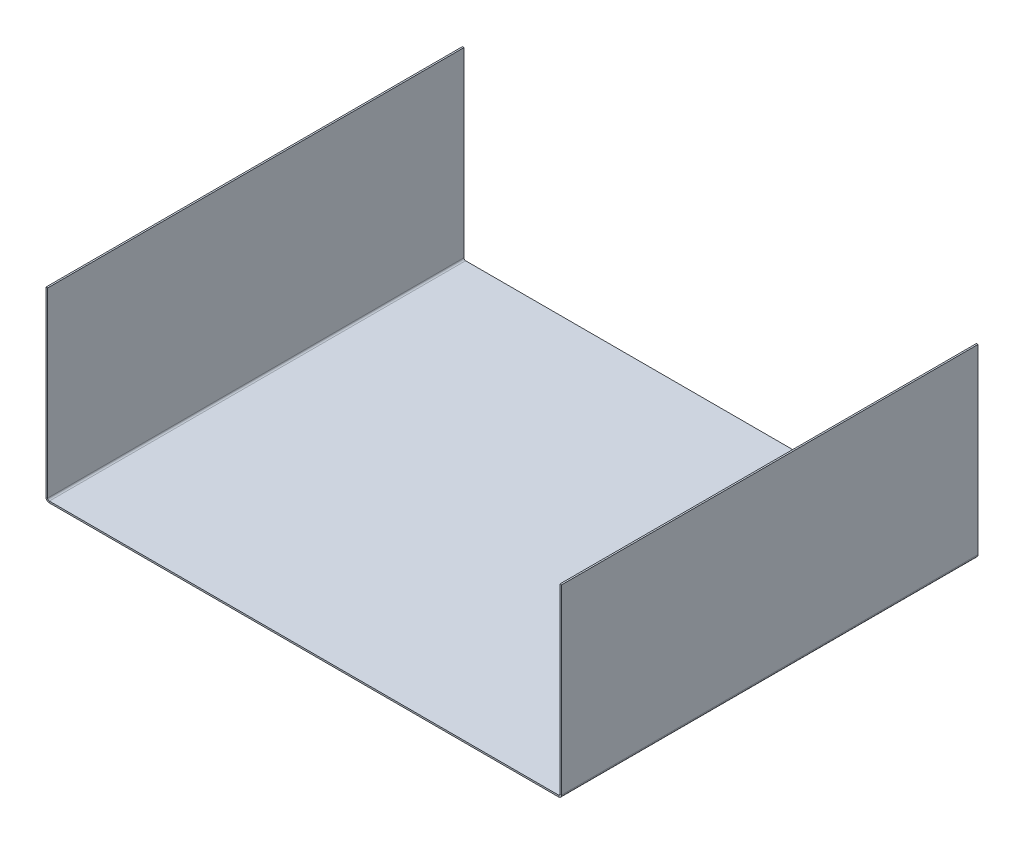
ISO-10303-21;
HEADER;
FILE_DESCRIPTION(('STEP AP214'),'2;1');
FILE_NAME('part.step','',(''),(''),'','','');
FILE_SCHEMA(('AUTOMOTIVE_DESIGN { 1 0 10303 214 1 1 1 1 }'));
ENDSEC;
DATA;
#1=APPLICATION_CONTEXT('core data for automotive mechanical design processes');
#2=APPLICATION_PROTOCOL_DEFINITION('international standard','automotive_design',2000,#1);
#3=PRODUCT_CONTEXT('',#1,'mechanical');
#4=PRODUCT('Part','Part','',(#3));
#5=PRODUCT_RELATED_PRODUCT_CATEGORY('part','',(#4));
#6=PRODUCT_DEFINITION_FORMATION('','',#4);
#7=PRODUCT_DEFINITION_CONTEXT('part definition',#1,'design');
#8=PRODUCT_DEFINITION('design','',#6,#7);
#9=PRODUCT_DEFINITION_SHAPE('','',#8);
#10=(LENGTH_UNIT() NAMED_UNIT(*) SI_UNIT(.MILLI.,.METRE.));
#11=(NAMED_UNIT(*) PLANE_ANGLE_UNIT() SI_UNIT($,.RADIAN.));
#12=(NAMED_UNIT(*) SI_UNIT($,.STERADIAN.) SOLID_ANGLE_UNIT());
#13=UNCERTAINTY_MEASURE_WITH_UNIT(LENGTH_MEASURE(1.E-05),#10,'distance_accuracy_value','');
#14=(GEOMETRIC_REPRESENTATION_CONTEXT(3) GLOBAL_UNCERTAINTY_ASSIGNED_CONTEXT((#13)) GLOBAL_UNIT_ASSIGNED_CONTEXT((#10,
#11,#12)) REPRESENTATION_CONTEXT('',''));
#15=CARTESIAN_POINT('',(0.,0.,0.));
#16=DIRECTION('',(0.,0.,1.));
#17=DIRECTION('',(1.,0.,0.));
#18=AXIS2_PLACEMENT_3D('',#15,#16,#17);
#19=CARTESIAN_POINT('',(0.,-0.7,0.));
#20=DIRECTION('',(0.,-1.,0.));
#21=DIRECTION('',(0.,0.,-1.));
#22=AXIS2_PLACEMENT_3D('',#19,#20,#21);
#23=PLANE('',#22);
#24=DIRECTION('',(-1.,0.,0.));
#25=VECTOR('',#24,1.);
#26=CARTESIAN_POINT('',(111.5,-0.7,-90.));
#27=LINE('',#26,#25);
#28=CARTESIAN_POINT('',(110.0634,-0.700000000000011,-90.));
#29=VERTEX_POINT('',#28);
#30=CARTESIAN_POINT('',(-110.0634,-0.7,-90.));
#31=VERTEX_POINT('',#30);
#32=EDGE_CURVE('E13',#29,#31,#27,.T.);
#33=ORIENTED_EDGE('',*,*,#32,.F.);
#34=DIRECTION('',(0.,0.,-1.));
#35=VECTOR('',#34,1.);
#36=CARTESIAN_POINT('',(110.0634,-0.700000000000011,-90.));
#37=LINE('',#36,#35);
#38=CARTESIAN_POINT('',(110.0634,-0.7,89.9999999999999));
#39=VERTEX_POINT('',#38);
#40=EDGE_CURVE('E208',#29,#39,#37,.F.);
#41=ORIENTED_EDGE('',*,*,#40,.T.);
#42=DIRECTION('',(1.,0.,0.));
#43=VECTOR('',#42,1.);
#44=CARTESIAN_POINT('',(111.5,-0.7,90.));
#45=LINE('',#44,#43);
#46=CARTESIAN_POINT('',(-110.0634,-0.700000000000011,90.));
#47=VERTEX_POINT('',#46);
#48=EDGE_CURVE('E85',#47,#39,#45,.T.);
#49=ORIENTED_EDGE('',*,*,#48,.F.);
#50=DIRECTION('',(0.,0.,1.));
#51=VECTOR('',#50,1.);
#52=CARTESIAN_POINT('',(-110.0634,-0.700000000000011,90.));
#53=LINE('',#52,#51);
#54=EDGE_CURVE('E259',#47,#31,#53,.F.);
#55=ORIENTED_EDGE('',*,*,#54,.T.);
#56=EDGE_LOOP('',(#33,#41,#49,#55));
#57=FACE_BOUND('',#56,.T.);
#58=ADVANCED_FACE('F76',(#57),#23,.T.);
#59=CARTESIAN_POINT('',(0.,0.,0.));
#60=DIRECTION('',(0.,-1.,0.));
#61=DIRECTION('',(0.,0.,-1.));
#62=AXIS2_PLACEMENT_3D('',#59,#60,#61);
#63=PLANE('',#62);
#64=DIRECTION('',(0.,0.,-1.));
#65=VECTOR('',#64,1.);
#66=CARTESIAN_POINT('',(110.0634,0.,-90.));
#67=LINE('',#66,#65);
#68=CARTESIAN_POINT('',(110.0634,0.,-90.));
#69=VERTEX_POINT('',#68);
#70=CARTESIAN_POINT('',(110.0634,0.,89.9999999999999));
#71=VERTEX_POINT('',#70);
#72=EDGE_CURVE('E219',#69,#71,#67,.F.);
#73=ORIENTED_EDGE('',*,*,#72,.F.);
#74=DIRECTION('',(-1.,0.,0.));
#75=VECTOR('',#74,1.);
#76=CARTESIAN_POINT('',(111.5,0.,-90.));
#77=LINE('',#76,#75);
#78=CARTESIAN_POINT('',(-110.0634,0.,-90.));
#79=VERTEX_POINT('',#78);
#80=EDGE_CURVE('E80',#69,#79,#77,.T.);
#81=ORIENTED_EDGE('',*,*,#80,.T.);
#82=DIRECTION('',(0.,0.,1.));
#83=VECTOR('',#82,1.);
#84=CARTESIAN_POINT('',(-110.0634,0.,90.));
#85=LINE('',#84,#83);
#86=CARTESIAN_POINT('',(-110.0634,0.,90.));
#87=VERTEX_POINT('',#86);
#88=EDGE_CURVE('E270',#87,#79,#85,.F.);
#89=ORIENTED_EDGE('',*,*,#88,.F.);
#90=DIRECTION('',(1.,0.,0.));
#91=VECTOR('',#90,1.);
#92=CARTESIAN_POINT('',(111.5,0.,90.));
#93=LINE('',#92,#91);
#94=EDGE_CURVE('E276',#87,#71,#93,.T.);
#95=ORIENTED_EDGE('',*,*,#94,.T.);
#96=EDGE_LOOP('',(#73,#81,#89,#95));
#97=FACE_BOUND('',#96,.T.);
#98=ADVANCED_FACE('F288',(#97),#63,.F.);
#99=CARTESIAN_POINT('',(111.5,-0.7,-90.));
#100=DIRECTION('',(0.,0.,-1.));
#101=DIRECTION('',(-1.,0.,0.));
#102=AXIS2_PLACEMENT_3D('',#99,#100,#101);
#103=PLANE('',#102);
#104=ORIENTED_EDGE('',*,*,#80,.F.);
#105=DIRECTION('',(0.,-1.,0.));
#106=VECTOR('',#105,1.);
#107=CARTESIAN_POINT('',(110.0634,0.,-90.));
#108=LINE('',#107,#106);
#109=EDGE_CURVE('E213',#69,#29,#108,.T.);
#110=ORIENTED_EDGE('',*,*,#109,.T.);
#111=ORIENTED_EDGE('',*,*,#32,.T.);
#112=DIRECTION('',(0.,-1.,0.));
#113=VECTOR('',#112,1.);
#114=CARTESIAN_POINT('',(-110.0634,0.,-90.));
#115=LINE('',#114,#113);
#116=EDGE_CURVE('E274',#79,#31,#115,.T.);
#117=ORIENTED_EDGE('',*,*,#116,.F.);
#118=EDGE_LOOP('',(#104,#110,#111,#117));
#119=FACE_BOUND('',#118,.T.);
#120=ADVANCED_FACE('F290',(#119),#103,.T.);
#121=CARTESIAN_POINT('',(111.5,-0.7,90.));
#122=DIRECTION('',(0.,0.,1.));
#123=DIRECTION('',(1.,0.,0.));
#124=AXIS2_PLACEMENT_3D('',#121,#122,#123);
#125=PLANE('',#124);
#126=DIRECTION('',(0.,-1.,0.));
#127=VECTOR('',#126,1.);
#128=CARTESIAN_POINT('',(110.0634,0.,89.9999999999999));
#129=LINE('',#128,#127);
#130=EDGE_CURVE('E224',#71,#39,#129,.T.);
#131=ORIENTED_EDGE('',*,*,#130,.F.);
#132=ORIENTED_EDGE('',*,*,#94,.F.);
#133=DIRECTION('',(0.,-1.,0.));
#134=VECTOR('',#133,1.);
#135=CARTESIAN_POINT('',(-110.0634,0.,90.));
#136=LINE('',#135,#134);
#137=EDGE_CURVE('E264',#87,#47,#136,.T.);
#138=ORIENTED_EDGE('',*,*,#137,.T.);
#139=ORIENTED_EDGE('',*,*,#48,.T.);
#140=EDGE_LOOP('',(#131,#132,#138,#139));
#141=FACE_BOUND('',#140,.T.);
#142=ADVANCED_FACE('F78',(#141),#125,.T.);
#143=CARTESIAN_POINT('',(-110.0634,0.736600000000006,-90.));
#144=DIRECTION('',(0.,0.,-1.));
#145=DIRECTION('',(-1.,0.,0.));
#146=AXIS2_PLACEMENT_3D('',#143,#144,#145);
#147=PLANE('',#146);
#148=DIRECTION('',(1.,0.,0.));
#149=VECTOR('',#148,1.);
#150=CARTESIAN_POINT('',(-111.5,0.736600000000001,-90.));
#151=LINE('',#150,#149);
#152=CARTESIAN_POINT('',(-110.8,0.736600000000004,-90.));
#153=VERTEX_POINT('',#152);
#154=CARTESIAN_POINT('',(-111.5,0.736600000000001,-90.));
#155=VERTEX_POINT('',#154);
#156=EDGE_CURVE('E226',#153,#155,#151,.F.);
#157=ORIENTED_EDGE('',*,*,#156,.F.);
#158=CARTESIAN_POINT('',(-110.0634,0.736600000000006,-90.));
#159=DIRECTION('',(0.,0.,1.));
#160=DIRECTION('',(1.,0.,0.));
#161=AXIS2_PLACEMENT_3D('',#158,#159,#160);
#162=CIRCLE('',#161,0.736600000000018);
#163=EDGE_CURVE('E267',#79,#153,#162,.F.);
#164=ORIENTED_EDGE('',*,*,#163,.F.);
#165=ORIENTED_EDGE('',*,*,#116,.T.);
#166=CARTESIAN_POINT('',(-110.0634,0.736600000000006,-90.));
#167=DIRECTION('',(0.,0.,1.));
#168=DIRECTION('',(1.,0.,0.));
#169=AXIS2_PLACEMENT_3D('',#166,#167,#168);
#170=CIRCLE('',#169,1.43660000000002);
#171=EDGE_CURVE('E93',#31,#155,#170,.F.);
#172=ORIENTED_EDGE('',*,*,#171,.T.);
#173=EDGE_LOOP('',(#157,#164,#165,#172));
#174=FACE_BOUND('',#173,.T.);
#175=ADVANCED_FACE('F294',(#174),#147,.T.);
#176=CARTESIAN_POINT('',(-110.0634,0.736600000000006,90.));
#177=DIRECTION('',(0.,0.,-1.));
#178=DIRECTION('',(-1.,0.,0.));
#179=AXIS2_PLACEMENT_3D('',#176,#177,#178);
#180=PLANE('',#179);
#181=CARTESIAN_POINT('',(-110.0634,0.736600000000006,90.));
#182=DIRECTION('',(0.,0.,1.));
#183=DIRECTION('',(1.,0.,0.));
#184=AXIS2_PLACEMENT_3D('',#181,#182,#183);
#185=CIRCLE('',#184,0.736600000000018);
#186=CARTESIAN_POINT('',(-110.8,0.736600000000004,90.));
#187=VERTEX_POINT('',#186);
#188=EDGE_CURVE('E232',#187,#87,#185,.T.);
#189=ORIENTED_EDGE('',*,*,#188,.F.);
#190=DIRECTION('',(1.,0.,0.));
#191=VECTOR('',#190,1.);
#192=CARTESIAN_POINT('',(-110.8,0.736600000000004,90.));
#193=LINE('',#192,#191);
#194=CARTESIAN_POINT('',(-111.5,0.736600000000001,90.));
#195=VERTEX_POINT('',#194);
#196=EDGE_CURVE('E252',#187,#195,#193,.F.);
#197=ORIENTED_EDGE('',*,*,#196,.T.);
#198=CARTESIAN_POINT('',(-110.0634,0.736600000000006,90.));
#199=DIRECTION('',(0.,0.,1.));
#200=DIRECTION('',(1.,0.,0.));
#201=AXIS2_PLACEMENT_3D('',#198,#199,#200);
#202=CIRCLE('',#201,1.43660000000002);
#203=EDGE_CURVE('E262',#195,#47,#202,.T.);
#204=ORIENTED_EDGE('',*,*,#203,.T.);
#205=ORIENTED_EDGE('',*,*,#137,.F.);
#206=EDGE_LOOP('',(#189,#197,#204,#205));
#207=FACE_BOUND('',#206,.T.);
#208=ADVANCED_FACE('F318',(#207),#180,.F.);
#209=CARTESIAN_POINT('',(-110.0634,0.736600000000006,90.));
#210=DIRECTION('',(0.,0.,1.));
#211=DIRECTION('',(-1.,0.,0.));
#212=AXIS2_PLACEMENT_3D('',#209,#210,#211);
#213=CYLINDRICAL_SURFACE('',#212,1.43660000000002);
#214=ORIENTED_EDGE('',*,*,#54,.F.);
#215=ORIENTED_EDGE('',*,*,#203,.F.);
#216=DIRECTION('',(0.,0.,1.));
#217=VECTOR('',#216,1.);
#218=CARTESIAN_POINT('',(-111.5,0.736600000000001,-90.));
#219=LINE('',#218,#217);
#220=EDGE_CURVE('E250',#195,#155,#219,.F.);
#221=ORIENTED_EDGE('',*,*,#220,.T.);
#222=ORIENTED_EDGE('',*,*,#171,.F.);
#223=EDGE_LOOP('',(#214,#215,#221,#222));
#224=FACE_BOUND('',#223,.T.);
#225=ADVANCED_FACE('F321',(#224),#213,.T.);
#226=CARTESIAN_POINT('',(-110.0634,0.736600000000006,90.));
#227=DIRECTION('',(0.,0.,1.));
#228=DIRECTION('',(-1.,0.,0.));
#229=AXIS2_PLACEMENT_3D('',#226,#227,#228);
#230=CYLINDRICAL_SURFACE('',#229,0.736600000000018);
#231=ORIENTED_EDGE('',*,*,#88,.T.);
#232=ORIENTED_EDGE('',*,*,#163,.T.);
#233=DIRECTION('',(0.,0.,1.));
#234=VECTOR('',#233,1.);
#235=CARTESIAN_POINT('',(-110.8,0.736600000000004,-90.));
#236=LINE('',#235,#234);
#237=EDGE_CURVE('E255',#153,#187,#236,.T.);
#238=ORIENTED_EDGE('',*,*,#237,.T.);
#239=ORIENTED_EDGE('',*,*,#188,.T.);
#240=EDGE_LOOP('',(#231,#232,#238,#239));
#241=FACE_BOUND('',#240,.T.);
#242=ADVANCED_FACE('F297',(#241),#230,.F.);
#243=CARTESIAN_POINT('',(-111.5,0.,-90.));
#244=DIRECTION('',(0.,0.,1.));
#245=DIRECTION('',(1.,0.,0.));
#246=AXIS2_PLACEMENT_3D('',#243,#244,#245);
#247=PLANE('',#246);
#248=ORIENTED_EDGE('',*,*,#156,.T.);
#249=DIRECTION('',(0.,-1.,0.));
#250=VECTOR('',#249,1.);
#251=CARTESIAN_POINT('',(-111.5,-3.92031038538797E-13,-90.));
#252=LINE('',#251,#250);
#253=CARTESIAN_POINT('',(-111.5,79.4366,-90.));
#254=VERTEX_POINT('',#253);
#255=EDGE_CURVE('E240',#254,#155,#252,.T.);
#256=ORIENTED_EDGE('',*,*,#255,.F.);
#257=DIRECTION('',(1.,0.,0.));
#258=VECTOR('',#257,1.);
#259=CARTESIAN_POINT('',(-111.5,79.4366,-90.));
#260=LINE('',#259,#258);
#261=CARTESIAN_POINT('',(-110.8,79.4366,-90.));
#262=VERTEX_POINT('',#261);
#263=EDGE_CURVE('E233',#254,#262,#260,.T.);
#264=ORIENTED_EDGE('',*,*,#263,.T.);
#265=DIRECTION('',(0.,1.,0.));
#266=VECTOR('',#265,1.);
#267=CARTESIAN_POINT('',(-110.8,0.,-90.));
#268=LINE('',#267,#266);
#269=EDGE_CURVE('E247',#262,#153,#268,.F.);
#270=ORIENTED_EDGE('',*,*,#269,.T.);
#271=EDGE_LOOP('',(#248,#256,#264,#270));
#272=FACE_BOUND('',#271,.T.);
#273=ADVANCED_FACE('F305',(#272),#247,.F.);
#274=CARTESIAN_POINT('',(-111.5,79.4366,90.));
#275=DIRECTION('',(0.,0.,-1.));
#276=DIRECTION('',(-1.,0.,0.));
#277=AXIS2_PLACEMENT_3D('',#274,#275,#276);
#278=PLANE('',#277);
#279=ORIENTED_EDGE('',*,*,#196,.F.);
#280=DIRECTION('',(0.,-1.,0.));
#281=VECTOR('',#280,1.);
#282=CARTESIAN_POINT('',(-110.8,79.4366,90.));
#283=LINE('',#282,#281);
#284=CARTESIAN_POINT('',(-110.8,79.4366,90.));
#285=VERTEX_POINT('',#284);
#286=EDGE_CURVE('E245',#187,#285,#283,.F.);
#287=ORIENTED_EDGE('',*,*,#286,.T.);
#288=DIRECTION('',(1.,0.,0.));
#289=VECTOR('',#288,1.);
#290=CARTESIAN_POINT('',(-111.5,79.4366,90.));
#291=LINE('',#290,#289);
#292=CARTESIAN_POINT('',(-111.5,79.4366,90.));
#293=VERTEX_POINT('',#292);
#294=EDGE_CURVE('E229',#293,#285,#291,.T.);
#295=ORIENTED_EDGE('',*,*,#294,.F.);
#296=DIRECTION('',(0.,1.,0.));
#297=VECTOR('',#296,1.);
#298=CARTESIAN_POINT('',(-111.5,-3.92031038538797E-13,90.));
#299=LINE('',#298,#297);
#300=EDGE_CURVE('E238',#195,#293,#299,.T.);
#301=ORIENTED_EDGE('',*,*,#300,.F.);
#302=EDGE_LOOP('',(#279,#287,#295,#301));
#303=FACE_BOUND('',#302,.T.);
#304=ADVANCED_FACE('F315',(#303),#278,.F.);
#305=CARTESIAN_POINT('',(-111.5,-3.92031038538797E-13,0.));
#306=DIRECTION('',(1.,0.,0.));
#307=DIRECTION('',(0.,1.,0.));
#308=AXIS2_PLACEMENT_3D('',#305,#306,#307);
#309=PLANE('',#308);
#310=ORIENTED_EDGE('',*,*,#220,.F.);
#311=ORIENTED_EDGE('',*,*,#300,.T.);
#312=DIRECTION('',(0.,0.,-1.));
#313=VECTOR('',#312,1.);
#314=CARTESIAN_POINT('',(-111.5,79.4366,0.));
#315=LINE('',#314,#313);
#316=EDGE_CURVE('E236',#293,#254,#315,.T.);
#317=ORIENTED_EDGE('',*,*,#316,.T.);
#318=ORIENTED_EDGE('',*,*,#255,.T.);
#319=EDGE_LOOP('',(#310,#311,#317,#318));
#320=FACE_BOUND('',#319,.T.);
#321=ADVANCED_FACE('F320',(#320),#309,.F.);
#322=CARTESIAN_POINT('',(-110.8,-3.89587001601607E-13,0.));
#323=DIRECTION('',(1.,0.,0.));
#324=DIRECTION('',(0.,1.,0.));
#325=AXIS2_PLACEMENT_3D('',#322,#323,#324);
#326=PLANE('',#325);
#327=ORIENTED_EDGE('',*,*,#286,.F.);
#328=ORIENTED_EDGE('',*,*,#237,.F.);
#329=ORIENTED_EDGE('',*,*,#269,.F.);
#330=DIRECTION('',(0.,0.,1.));
#331=VECTOR('',#330,1.);
#332=CARTESIAN_POINT('',(-110.8,79.4366,-90.));
#333=LINE('',#332,#331);
#334=EDGE_CURVE('E243',#285,#262,#333,.F.);
#335=ORIENTED_EDGE('',*,*,#334,.F.);
#336=EDGE_LOOP('',(#327,#328,#329,#335));
#337=FACE_BOUND('',#336,.T.);
#338=ADVANCED_FACE('F302',(#337),#326,.T.);
#339=CARTESIAN_POINT('',(-111.5,79.4366,-90.));
#340=DIRECTION('',(0.,-1.,0.));
#341=DIRECTION('',(1.,0.,0.));
#342=AXIS2_PLACEMENT_3D('',#339,#340,#341);
#343=PLANE('',#342);
#344=ORIENTED_EDGE('',*,*,#334,.T.);
#345=ORIENTED_EDGE('',*,*,#263,.F.);
#346=ORIENTED_EDGE('',*,*,#316,.F.);
#347=ORIENTED_EDGE('',*,*,#294,.T.);
#348=EDGE_LOOP('',(#344,#345,#346,#347));
#349=FACE_BOUND('',#348,.T.);
#350=ADVANCED_FACE('F310',(#349),#343,.F.);
#351=CARTESIAN_POINT('',(110.0634,0.736600000000006,89.9999999999999));
#352=DIRECTION('',(0.,0.,1.));
#353=DIRECTION('',(1.,0.,0.));
#354=AXIS2_PLACEMENT_3D('',#351,#352,#353);
#355=PLANE('',#354);
#356=DIRECTION('',(-1.,0.,0.));
#357=VECTOR('',#356,1.);
#358=CARTESIAN_POINT('',(111.5,0.736600000000001,89.9999999999999));
#359=LINE('',#358,#357);
#360=CARTESIAN_POINT('',(110.8,0.736600000000004,89.9999999999999));
#361=VERTEX_POINT('',#360);
#362=CARTESIAN_POINT('',(111.5,0.736600000000001,89.9999999999999));
#363=VERTEX_POINT('',#362);
#364=EDGE_CURVE('E191',#361,#363,#359,.F.);
#365=ORIENTED_EDGE('',*,*,#364,.F.);
#366=CARTESIAN_POINT('',(110.0634,0.736600000000006,89.9999999999999));
#367=DIRECTION('',(0.,0.,-1.));
#368=DIRECTION('',(-1.,0.,0.));
#369=AXIS2_PLACEMENT_3D('',#366,#367,#368);
#370=CIRCLE('',#369,0.736600000000018);
#371=EDGE_CURVE('E216',#71,#361,#370,.F.);
#372=ORIENTED_EDGE('',*,*,#371,.F.);
#373=ORIENTED_EDGE('',*,*,#130,.T.);
#374=CARTESIAN_POINT('',(110.0634,0.736600000000006,89.9999999999999));
#375=DIRECTION('',(0.,0.,-1.));
#376=DIRECTION('',(-1.,0.,0.));
#377=AXIS2_PLACEMENT_3D('',#374,#375,#376);
#378=CIRCLE('',#377,1.43660000000002);
#379=EDGE_CURVE('E101',#39,#363,#378,.F.);
#380=ORIENTED_EDGE('',*,*,#379,.T.);
#381=EDGE_LOOP('',(#365,#372,#373,#380));
#382=FACE_BOUND('',#381,.T.);
#383=ADVANCED_FACE('F328',(#382),#355,.T.);
#384=CARTESIAN_POINT('',(110.0634,0.736600000000006,-90.));
#385=DIRECTION('',(0.,0.,1.));
#386=DIRECTION('',(1.,0.,0.));
#387=AXIS2_PLACEMENT_3D('',#384,#385,#386);
#388=PLANE('',#387);
#389=CARTESIAN_POINT('',(110.0634,0.736600000000006,-90.));
#390=DIRECTION('',(0.,0.,-1.));
#391=DIRECTION('',(-1.,0.,0.));
#392=AXIS2_PLACEMENT_3D('',#389,#390,#391);
#393=CIRCLE('',#392,0.736600000000018);
#394=CARTESIAN_POINT('',(110.8,0.736600000000004,-90.));
#395=VERTEX_POINT('',#394);
#396=EDGE_CURVE('E221',#395,#69,#393,.T.);
#397=ORIENTED_EDGE('',*,*,#396,.F.);
#398=DIRECTION('',(-1.,0.,0.));
#399=VECTOR('',#398,1.);
#400=CARTESIAN_POINT('',(110.8,0.736600000000004,-90.));
#401=LINE('',#400,#399);
#402=CARTESIAN_POINT('',(111.5,0.736600000000001,-90.));
#403=VERTEX_POINT('',#402);
#404=EDGE_CURVE('E202',#395,#403,#401,.F.);
#405=ORIENTED_EDGE('',*,*,#404,.T.);
#406=CARTESIAN_POINT('',(110.0634,0.736600000000006,-90.));
#407=DIRECTION('',(0.,0.,-1.));
#408=DIRECTION('',(-1.,0.,0.));
#409=AXIS2_PLACEMENT_3D('',#406,#407,#408);
#410=CIRCLE('',#409,1.43660000000002);
#411=EDGE_CURVE('E211',#403,#29,#410,.T.);
#412=ORIENTED_EDGE('',*,*,#411,.T.);
#413=ORIENTED_EDGE('',*,*,#109,.F.);
#414=EDGE_LOOP('',(#397,#405,#412,#413));
#415=FACE_BOUND('',#414,.T.);
#416=ADVANCED_FACE('F341',(#415),#388,.F.);
#417=CARTESIAN_POINT('',(110.0634,0.736600000000006,-90.));
#418=DIRECTION('',(0.,0.,-1.));
#419=DIRECTION('',(1.,0.,0.));
#420=AXIS2_PLACEMENT_3D('',#417,#418,#419);
#421=CYLINDRICAL_SURFACE('',#420,1.43660000000002);
#422=ORIENTED_EDGE('',*,*,#40,.F.);
#423=ORIENTED_EDGE('',*,*,#411,.F.);
#424=DIRECTION('',(0.,0.,-1.));
#425=VECTOR('',#424,1.);
#426=CARTESIAN_POINT('',(111.5,0.736600000000001,89.9999999999999));
#427=LINE('',#426,#425);
#428=EDGE_CURVE('E200',#403,#363,#427,.F.);
#429=ORIENTED_EDGE('',*,*,#428,.T.);
#430=ORIENTED_EDGE('',*,*,#379,.F.);
#431=EDGE_LOOP('',(#422,#423,#429,#430));
#432=FACE_BOUND('',#431,.T.);
#433=ADVANCED_FACE('F342',(#432),#421,.T.);
#434=CARTESIAN_POINT('',(110.0634,0.736600000000006,-90.));
#435=DIRECTION('',(0.,0.,-1.));
#436=DIRECTION('',(1.,0.,0.));
#437=AXIS2_PLACEMENT_3D('',#434,#435,#436);
#438=CYLINDRICAL_SURFACE('',#437,0.736600000000018);
#439=ORIENTED_EDGE('',*,*,#72,.T.);
#440=ORIENTED_EDGE('',*,*,#371,.T.);
#441=DIRECTION('',(0.,0.,-1.));
#442=VECTOR('',#441,1.);
#443=CARTESIAN_POINT('',(110.8,0.736600000000004,89.9999999999999));
#444=LINE('',#443,#442);
#445=EDGE_CURVE('E205',#361,#395,#444,.T.);
#446=ORIENTED_EDGE('',*,*,#445,.T.);
#447=ORIENTED_EDGE('',*,*,#396,.T.);
#448=EDGE_LOOP('',(#439,#440,#446,#447));
#449=FACE_BOUND('',#448,.T.);
#450=ADVANCED_FACE('F331',(#449),#438,.F.);
#451=CARTESIAN_POINT('',(111.5,0.,89.9999999999999));
#452=DIRECTION('',(0.,0.,-1.));
#453=DIRECTION('',(-1.,0.,0.));
#454=AXIS2_PLACEMENT_3D('',#451,#452,#453);
#455=PLANE('',#454);
#456=ORIENTED_EDGE('',*,*,#364,.T.);
#457=DIRECTION('',(0.,-1.,0.));
#458=VECTOR('',#457,1.);
#459=CARTESIAN_POINT('',(111.5,-3.92031038538798E-13,89.9999999999999));
#460=LINE('',#459,#458);
#461=CARTESIAN_POINT('',(111.5,79.4366,89.9999999999999));
#462=VERTEX_POINT('',#461);
#463=EDGE_CURVE('E172',#462,#363,#460,.T.);
#464=ORIENTED_EDGE('',*,*,#463,.F.);
#465=DIRECTION('',(-1.,0.,0.));
#466=VECTOR('',#465,1.);
#467=CARTESIAN_POINT('',(111.5,79.4366,89.9999999999999));
#468=LINE('',#467,#466);
#469=CARTESIAN_POINT('',(110.8,79.4366,89.9999999999999));
#470=VERTEX_POINT('',#469);
#471=EDGE_CURVE('E178',#462,#470,#468,.T.);
#472=ORIENTED_EDGE('',*,*,#471,.T.);
#473=DIRECTION('',(0.,1.,0.));
#474=VECTOR('',#473,1.);
#475=CARTESIAN_POINT('',(110.8,0.,89.9999999999999));
#476=LINE('',#475,#474);
#477=EDGE_CURVE('E198',#470,#361,#476,.F.);
#478=ORIENTED_EDGE('',*,*,#477,.T.);
#479=EDGE_LOOP('',(#456,#464,#472,#478));
#480=FACE_BOUND('',#479,.T.);
#481=ADVANCED_FACE('F190',(#480),#455,.F.);
#482=CARTESIAN_POINT('',(111.5,79.4366,-90.));
#483=DIRECTION('',(0.,0.,1.));
#484=DIRECTION('',(1.,0.,0.));
#485=AXIS2_PLACEMENT_3D('',#482,#483,#484);
#486=PLANE('',#485);
#487=ORIENTED_EDGE('',*,*,#404,.F.);
#488=DIRECTION('',(0.,-1.,0.));
#489=VECTOR('',#488,1.);
#490=CARTESIAN_POINT('',(110.8,79.4366,-90.));
#491=LINE('',#490,#489);
#492=CARTESIAN_POINT('',(110.8,79.4366,-90.));
#493=VERTEX_POINT('',#492);
#494=EDGE_CURVE('E194',#395,#493,#491,.F.);
#495=ORIENTED_EDGE('',*,*,#494,.T.);
#496=DIRECTION('',(-1.,0.,0.));
#497=VECTOR('',#496,1.);
#498=CARTESIAN_POINT('',(111.5,79.4366,-90.));
#499=LINE('',#498,#497);
#500=CARTESIAN_POINT('',(111.5,79.4366,-90.));
#501=VERTEX_POINT('',#500);
#502=EDGE_CURVE('E187',#501,#493,#499,.T.);
#503=ORIENTED_EDGE('',*,*,#502,.F.);
#504=DIRECTION('',(0.,1.,0.));
#505=VECTOR('',#504,1.);
#506=CARTESIAN_POINT('',(111.5,-3.92031038538797E-13,-90.));
#507=LINE('',#506,#505);
#508=EDGE_CURVE('E174',#403,#501,#507,.T.);
#509=ORIENTED_EDGE('',*,*,#508,.F.);
#510=EDGE_LOOP('',(#487,#495,#503,#509));
#511=FACE_BOUND('',#510,.T.);
#512=ADVANCED_FACE('F338',(#511),#486,.F.);
#513=CARTESIAN_POINT('',(111.5,-3.92031038538797E-13,0.));
#514=DIRECTION('',(-1.,0.,0.));
#515=DIRECTION('',(0.,-1.,0.));
#516=AXIS2_PLACEMENT_3D('',#513,#514,#515);
#517=PLANE('',#516);
#518=ORIENTED_EDGE('',*,*,#428,.F.);
#519=ORIENTED_EDGE('',*,*,#508,.T.);
#520=DIRECTION('',(0.,0.,1.));
#521=VECTOR('',#520,1.);
#522=CARTESIAN_POINT('',(111.5,79.4366,0.));
#523=LINE('',#522,#521);
#524=EDGE_CURVE('E167',#501,#462,#523,.T.);
#525=ORIENTED_EDGE('',*,*,#524,.T.);
#526=ORIENTED_EDGE('',*,*,#463,.T.);
#527=EDGE_LOOP('',(#518,#519,#525,#526));
#528=FACE_BOUND('',#527,.T.);
#529=ADVANCED_FACE('F170',(#528),#517,.F.);
#530=CARTESIAN_POINT('',(110.8,-3.89587001601607E-13,0.));
#531=DIRECTION('',(-1.,0.,0.));
#532=DIRECTION('',(0.,-1.,0.));
#533=AXIS2_PLACEMENT_3D('',#530,#531,#532);
#534=PLANE('',#533);
#535=ORIENTED_EDGE('',*,*,#494,.F.);
#536=ORIENTED_EDGE('',*,*,#445,.F.);
#537=ORIENTED_EDGE('',*,*,#477,.F.);
#538=DIRECTION('',(0.,0.,-1.));
#539=VECTOR('',#538,1.);
#540=CARTESIAN_POINT('',(110.8,79.4366,89.9999999999999));
#541=LINE('',#540,#539);
#542=EDGE_CURVE('E183',#493,#470,#541,.F.);
#543=ORIENTED_EDGE('',*,*,#542,.F.);
#544=EDGE_LOOP('',(#535,#536,#537,#543));
#545=FACE_BOUND('',#544,.T.);
#546=ADVANCED_FACE('F335',(#545),#534,.T.);
#547=CARTESIAN_POINT('',(111.5,79.4366,89.9999999999999));
#548=DIRECTION('',(0.,-1.,0.));
#549=DIRECTION('',(1.,0.,0.));
#550=AXIS2_PLACEMENT_3D('',#547,#548,#549);
#551=PLANE('',#550);
#552=ORIENTED_EDGE('',*,*,#542,.T.);
#553=ORIENTED_EDGE('',*,*,#471,.F.);
#554=ORIENTED_EDGE('',*,*,#524,.F.);
#555=ORIENTED_EDGE('',*,*,#502,.T.);
#556=EDGE_LOOP('',(#552,#553,#554,#555));
#557=FACE_BOUND('',#556,.T.);
#558=ADVANCED_FACE('F181',(#557),#551,.F.);
#559=CLOSED_SHELL('',(#58,#98,#120,#142,#175,#208,#225,#242,#273,#304,#321,#338,#350,#383,#416,
#433,#450,#481,#512,#529,#546,#558));
#560=MANIFOLD_SOLID_BREP('B2',#559);
#561=ADVANCED_BREP_SHAPE_REPRESENTATION('',(#18,#560),#14);
#562=SHAPE_DEFINITION_REPRESENTATION(#9,#561);
ENDSEC;
END-ISO-10303-21;
